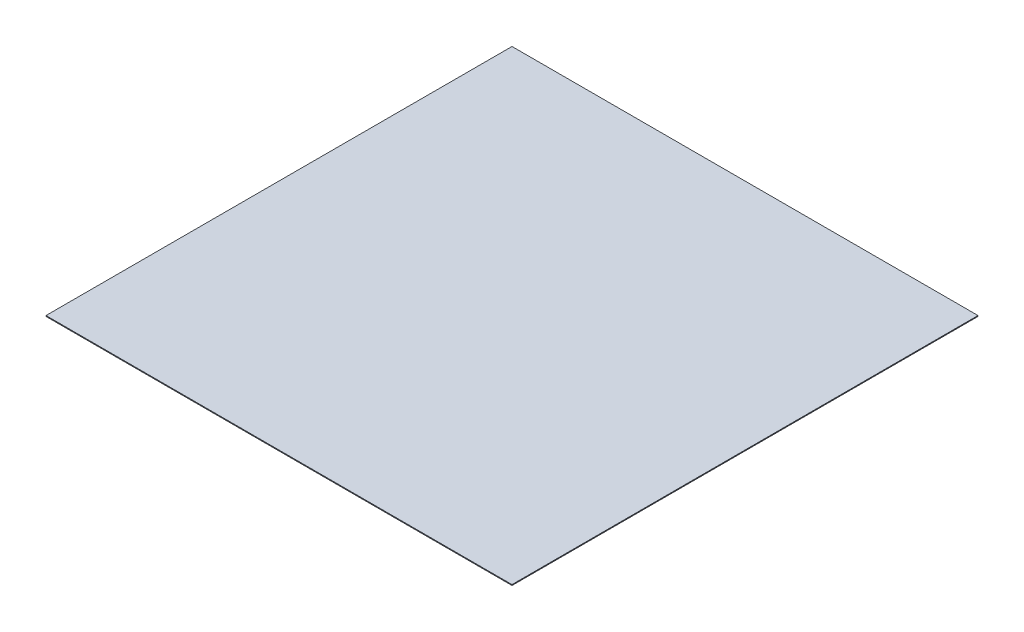
ISO-10303-21;
HEADER;
FILE_DESCRIPTION(('STEP AP214'),'2;1');
FILE_NAME('part.step','',(''),(''),'','','');
FILE_SCHEMA(('AUTOMOTIVE_DESIGN { 1 0 10303 214 1 1 1 1 }'));
ENDSEC;
DATA;
#1=APPLICATION_CONTEXT('core data for automotive mechanical design processes');
#2=APPLICATION_PROTOCOL_DEFINITION('international standard','automotive_design',2000,#1);
#3=PRODUCT_CONTEXT('',#1,'mechanical');
#4=PRODUCT('Part','Part','',(#3));
#5=PRODUCT_RELATED_PRODUCT_CATEGORY('part','',(#4));
#6=PRODUCT_DEFINITION_FORMATION('','',#4);
#7=PRODUCT_DEFINITION_CONTEXT('part definition',#1,'design');
#8=PRODUCT_DEFINITION('design','',#6,#7);
#9=PRODUCT_DEFINITION_SHAPE('','',#8);
#10=(LENGTH_UNIT() NAMED_UNIT(*) SI_UNIT(.MILLI.,.METRE.));
#11=(NAMED_UNIT(*) PLANE_ANGLE_UNIT() SI_UNIT($,.RADIAN.));
#12=(NAMED_UNIT(*) SI_UNIT($,.STERADIAN.) SOLID_ANGLE_UNIT());
#13=UNCERTAINTY_MEASURE_WITH_UNIT(LENGTH_MEASURE(1.E-05),#10,'distance_accuracy_value','');
#14=(GEOMETRIC_REPRESENTATION_CONTEXT(3) GLOBAL_UNCERTAINTY_ASSIGNED_CONTEXT((#13)) GLOBAL_UNIT_ASSIGNED_CONTEXT((#10,
#11,#12)) REPRESENTATION_CONTEXT('',''));
#15=CARTESIAN_POINT('',(0.,0.,0.));
#16=DIRECTION('',(0.,0.,1.));
#17=DIRECTION('',(1.,0.,0.));
#18=AXIS2_PLACEMENT_3D('',#15,#16,#17);
#19=CARTESIAN_POINT('',(69.85,0.125,69.85));
#20=DIRECTION('',(-1.,0.,0.));
#21=DIRECTION('',(0.,0.,1.));
#22=AXIS2_PLACEMENT_3D('',#19,#20,#21);
#23=PLANE('',#22);
#24=DIRECTION('',(0.,0.,-1.));
#25=VECTOR('',#24,1.);
#26=CARTESIAN_POINT('',(69.85,-0.125,69.85));
#27=LINE('',#26,#25);
#28=CARTESIAN_POINT('',(69.85,-0.125,69.85));
#29=VERTEX_POINT('',#28);
#30=CARTESIAN_POINT('',(69.85,-0.125,-69.85));
#31=VERTEX_POINT('',#30);
#32=EDGE_CURVE('E98',#29,#31,#27,.T.);
#33=ORIENTED_EDGE('',*,*,#32,.T.);
#34=DIRECTION('',(0.,-1.,0.));
#35=VECTOR('',#34,1.);
#36=CARTESIAN_POINT('',(69.85,0.125,-69.85));
#37=LINE('',#36,#35);
#38=CARTESIAN_POINT('',(69.85,0.125,-69.85));
#39=VERTEX_POINT('',#38);
#40=EDGE_CURVE('E11',#39,#31,#37,.T.);
#41=ORIENTED_EDGE('',*,*,#40,.F.);
#42=DIRECTION('',(0.,0.,-1.));
#43=VECTOR('',#42,1.);
#44=CARTESIAN_POINT('',(69.85,0.125,69.85));
#45=LINE('',#44,#43);
#46=CARTESIAN_POINT('',(69.85,0.125,69.85));
#47=VERTEX_POINT('',#46);
#48=EDGE_CURVE('E86',#47,#39,#45,.T.);
#49=ORIENTED_EDGE('',*,*,#48,.F.);
#50=DIRECTION('',(0.,-1.,0.));
#51=VECTOR('',#50,1.);
#52=CARTESIAN_POINT('',(69.85,0.125,69.85));
#53=LINE('',#52,#51);
#54=EDGE_CURVE('E94',#47,#29,#53,.T.);
#55=ORIENTED_EDGE('',*,*,#54,.T.);
#56=EDGE_LOOP('',(#33,#41,#49,#55));
#57=FACE_BOUND('',#56,.T.);
#58=ADVANCED_FACE('F35',(#57),#23,.F.);
#59=CARTESIAN_POINT('',(-69.85,0.125,-69.85));
#60=DIRECTION('',(0.,0.,1.));
#61=DIRECTION('',(1.,0.,0.));
#62=AXIS2_PLACEMENT_3D('',#59,#60,#61);
#63=PLANE('',#62);
#64=DIRECTION('',(-1.,0.,0.));
#65=VECTOR('',#64,1.);
#66=CARTESIAN_POINT('',(-69.85,-0.125,-69.85));
#67=LINE('',#66,#65);
#68=CARTESIAN_POINT('',(-69.85,-0.125,-69.85));
#69=VERTEX_POINT('',#68);
#70=EDGE_CURVE('E90',#31,#69,#67,.T.);
#71=ORIENTED_EDGE('',*,*,#70,.T.);
#72=DIRECTION('',(0.,-1.,0.));
#73=VECTOR('',#72,1.);
#74=CARTESIAN_POINT('',(-69.85,0.125,-69.85));
#75=LINE('',#74,#73);
#76=CARTESIAN_POINT('',(-69.85,0.125,-69.85));
#77=VERTEX_POINT('',#76);
#78=EDGE_CURVE('E43',#77,#69,#75,.T.);
#79=ORIENTED_EDGE('',*,*,#78,.F.);
#80=DIRECTION('',(-1.,0.,0.));
#81=VECTOR('',#80,1.);
#82=CARTESIAN_POINT('',(-69.85,0.125,-69.85));
#83=LINE('',#82,#81);
#84=EDGE_CURVE('E81',#39,#77,#83,.T.);
#85=ORIENTED_EDGE('',*,*,#84,.F.);
#86=ORIENTED_EDGE('',*,*,#40,.T.);
#87=EDGE_LOOP('',(#71,#79,#85,#86));
#88=FACE_BOUND('',#87,.T.);
#89=ADVANCED_FACE('F89',(#88),#63,.F.);
#90=CARTESIAN_POINT('',(-69.85,0.125,69.85));
#91=DIRECTION('',(1.,0.,0.));
#92=DIRECTION('',(0.,0.,-1.));
#93=AXIS2_PLACEMENT_3D('',#90,#91,#92);
#94=PLANE('',#93);
#95=DIRECTION('',(0.,0.,1.));
#96=VECTOR('',#95,1.);
#97=CARTESIAN_POINT('',(-69.85,-0.125,69.85));
#98=LINE('',#97,#96);
#99=CARTESIAN_POINT('',(-69.85,-0.125,69.85));
#100=VERTEX_POINT('',#99);
#101=EDGE_CURVE('E68',#69,#100,#98,.T.);
#102=ORIENTED_EDGE('',*,*,#101,.T.);
#103=DIRECTION('',(0.,-1.,0.));
#104=VECTOR('',#103,1.);
#105=CARTESIAN_POINT('',(-69.85,0.125,69.85));
#106=LINE('',#105,#104);
#107=CARTESIAN_POINT('',(-69.85,0.125,69.85));
#108=VERTEX_POINT('',#107);
#109=EDGE_CURVE('E91',#108,#100,#106,.T.);
#110=ORIENTED_EDGE('',*,*,#109,.F.);
#111=DIRECTION('',(0.,0.,1.));
#112=VECTOR('',#111,1.);
#113=CARTESIAN_POINT('',(-69.85,0.125,69.85));
#114=LINE('',#113,#112);
#115=EDGE_CURVE('E84',#77,#108,#114,.T.);
#116=ORIENTED_EDGE('',*,*,#115,.F.);
#117=ORIENTED_EDGE('',*,*,#78,.T.);
#118=EDGE_LOOP('',(#102,#110,#116,#117));
#119=FACE_BOUND('',#118,.T.);
#120=ADVANCED_FACE('F92',(#119),#94,.F.);
#121=CARTESIAN_POINT('',(-69.85,0.125,69.85));
#122=DIRECTION('',(0.,0.,-1.));
#123=DIRECTION('',(-1.,0.,0.));
#124=AXIS2_PLACEMENT_3D('',#121,#122,#123);
#125=PLANE('',#124);
#126=DIRECTION('',(1.,0.,0.));
#127=VECTOR('',#126,1.);
#128=CARTESIAN_POINT('',(-69.85,-0.125,69.85));
#129=LINE('',#128,#127);
#130=EDGE_CURVE('E74',#100,#29,#129,.T.);
#131=ORIENTED_EDGE('',*,*,#130,.T.);
#132=ORIENTED_EDGE('',*,*,#54,.F.);
#133=DIRECTION('',(1.,0.,0.));
#134=VECTOR('',#133,1.);
#135=CARTESIAN_POINT('',(-69.85,0.125,69.85));
#136=LINE('',#135,#134);
#137=EDGE_CURVE('E51',#108,#47,#136,.T.);
#138=ORIENTED_EDGE('',*,*,#137,.F.);
#139=ORIENTED_EDGE('',*,*,#109,.T.);
#140=EDGE_LOOP('',(#131,#132,#138,#139));
#141=FACE_BOUND('',#140,.T.);
#142=ADVANCED_FACE('F105',(#141),#125,.F.);
#143=CARTESIAN_POINT('',(0.,0.125,0.));
#144=DIRECTION('',(0.,-1.,0.));
#145=DIRECTION('',(0.,0.,-1.));
#146=AXIS2_PLACEMENT_3D('',#143,#144,#145);
#147=PLANE('',#146);
#148=ORIENTED_EDGE('',*,*,#48,.T.);
#149=ORIENTED_EDGE('',*,*,#84,.T.);
#150=ORIENTED_EDGE('',*,*,#115,.T.);
#151=ORIENTED_EDGE('',*,*,#137,.T.);
#152=EDGE_LOOP('',(#148,#149,#150,#151));
#153=FACE_BOUND('',#152,.T.);
#154=ADVANCED_FACE('F82',(#153),#147,.F.);
#155=CARTESIAN_POINT('',(0.,-0.125,0.));
#156=DIRECTION('',(0.,-1.,0.));
#157=DIRECTION('',(0.,0.,-1.));
#158=AXIS2_PLACEMENT_3D('',#155,#156,#157);
#159=PLANE('',#158);
#160=ORIENTED_EDGE('',*,*,#32,.F.);
#161=ORIENTED_EDGE('',*,*,#130,.F.);
#162=ORIENTED_EDGE('',*,*,#101,.F.);
#163=ORIENTED_EDGE('',*,*,#70,.F.);
#164=EDGE_LOOP('',(#160,#161,#162,#163));
#165=FACE_BOUND('',#164,.T.);
#166=ADVANCED_FACE('F108',(#165),#159,.T.);
#167=CLOSED_SHELL('',(#58,#89,#120,#142,#154,#166));
#168=MANIFOLD_SOLID_BREP('B2',#167);
#169=ADVANCED_BREP_SHAPE_REPRESENTATION('',(#18,#168),#14);
#170=SHAPE_DEFINITION_REPRESENTATION(#9,#169);
ENDSEC;
END-ISO-10303-21;
